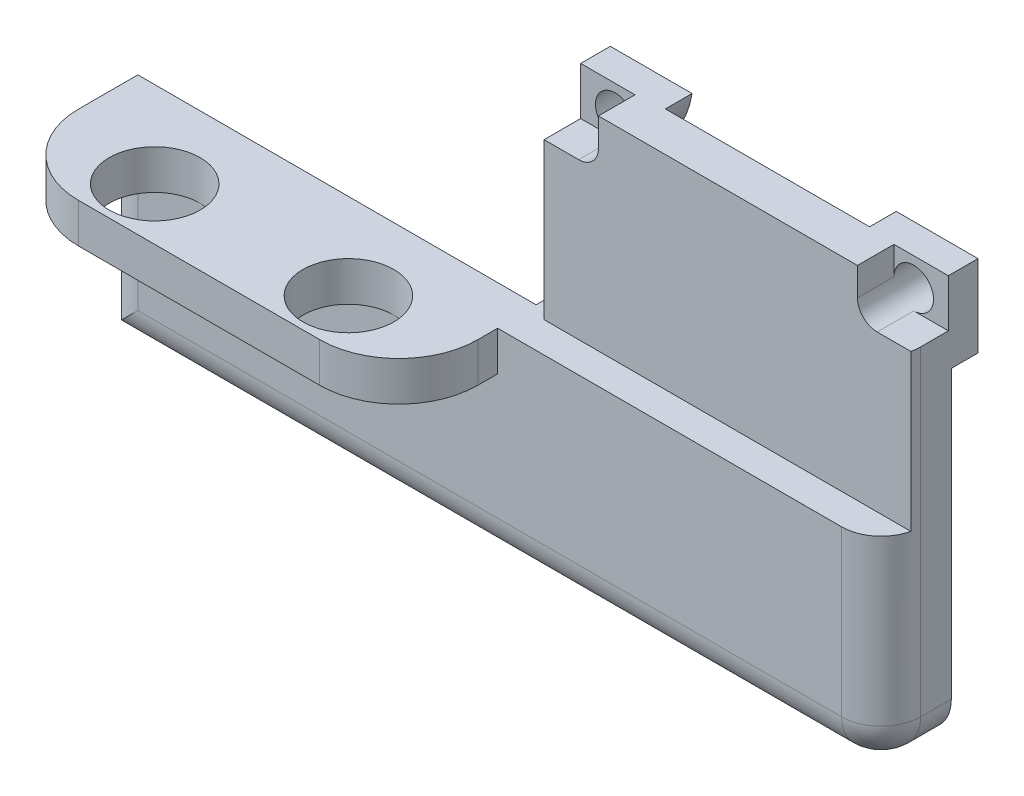
ISO-10303-21;
HEADER;
FILE_DESCRIPTION(('STEP AP214'),'2;1');
FILE_NAME('part.step','',(''),(''),'','','');
FILE_SCHEMA(('AUTOMOTIVE_DESIGN { 1 0 10303 214 1 1 1 1 }'));
ENDSEC;
DATA;
#1=APPLICATION_CONTEXT('core data for automotive mechanical design processes');
#2=APPLICATION_PROTOCOL_DEFINITION('international standard','automotive_design',2000,#1);
#3=PRODUCT_CONTEXT('',#1,'mechanical');
#4=PRODUCT('Part','Part','',(#3));
#5=PRODUCT_RELATED_PRODUCT_CATEGORY('part','',(#4));
#6=PRODUCT_DEFINITION_FORMATION('','',#4);
#7=PRODUCT_DEFINITION_CONTEXT('part definition',#1,'design');
#8=PRODUCT_DEFINITION('design','',#6,#7);
#9=PRODUCT_DEFINITION_SHAPE('','',#8);
#10=(LENGTH_UNIT() NAMED_UNIT(*) SI_UNIT(.MILLI.,.METRE.));
#11=(NAMED_UNIT(*) PLANE_ANGLE_UNIT() SI_UNIT($,.RADIAN.));
#12=(NAMED_UNIT(*) SI_UNIT($,.STERADIAN.) SOLID_ANGLE_UNIT());
#13=UNCERTAINTY_MEASURE_WITH_UNIT(LENGTH_MEASURE(1.E-05),#10,'distance_accuracy_value','');
#14=(GEOMETRIC_REPRESENTATION_CONTEXT(3) GLOBAL_UNCERTAINTY_ASSIGNED_CONTEXT((#13)) GLOBAL_UNIT_ASSIGNED_CONTEXT((#10,
#11,#12)) REPRESENTATION_CONTEXT('',''));
#15=CARTESIAN_POINT('',(0.,0.,0.));
#16=DIRECTION('',(0.,0.,1.));
#17=DIRECTION('',(1.,0.,0.));
#18=AXIS2_PLACEMENT_3D('',#15,#16,#17);
#19=CARTESIAN_POINT('',(6.1,10.325,3.));
#20=DIRECTION('',(0.,1.,0.));
#21=DIRECTION('',(0.,0.,1.));
#22=AXIS2_PLACEMENT_3D('',#19,#20,#21);
#23=CYLINDRICAL_SURFACE('',#22,4.);
#24=DIRECTION('',(0.,-1.,0.));
#25=VECTOR('',#24,1.);
#26=CARTESIAN_POINT('',(10.1,10.325,3.));
#27=LINE('',#26,#25);
#28=CARTESIAN_POINT('',(10.1,20.65,3.));
#29=VERTEX_POINT('',#28);
#30=CARTESIAN_POINT('',(10.1,18.65,3.));
#31=VERTEX_POINT('',#30);
#32=EDGE_CURVE('E509',#29,#31,#27,.T.);
#33=ORIENTED_EDGE('',*,*,#32,.F.);
#34=CARTESIAN_POINT('',(6.1,20.65,3.));
#35=DIRECTION('',(0.,-1.,0.));
#36=DIRECTION('',(0.,0.,-1.));
#37=AXIS2_PLACEMENT_3D('',#34,#35,#36);
#38=CIRCLE('',#37,4.);
#39=CARTESIAN_POINT('',(6.1,20.65,7.));
#40=VERTEX_POINT('',#39);
#41=EDGE_CURVE('E48',#40,#29,#38,.F.);
#42=ORIENTED_EDGE('',*,*,#41,.F.);
#43=DIRECTION('',(0.,-1.,0.));
#44=VECTOR('',#43,1.);
#45=CARTESIAN_POINT('',(6.1,10.325,7.));
#46=LINE('',#45,#44);
#47=CARTESIAN_POINT('',(6.1,18.65,7.));
#48=VERTEX_POINT('',#47);
#49=EDGE_CURVE('E513',#48,#40,#46,.F.);
#50=ORIENTED_EDGE('',*,*,#49,.F.);
#51=CARTESIAN_POINT('',(6.1,18.65,3.));
#52=DIRECTION('',(0.,1.,0.));
#53=DIRECTION('',(0.,0.,1.));
#54=AXIS2_PLACEMENT_3D('',#51,#52,#53);
#55=CIRCLE('',#54,4.);
#56=EDGE_CURVE('E11',#31,#48,#55,.F.);
#57=ORIENTED_EDGE('',*,*,#56,.F.);
#58=EDGE_LOOP('',(#33,#42,#50,#57));
#59=FACE_BOUND('',#58,.T.);
#60=ADVANCED_FACE('F40',(#59),#23,.T.);
#61=CARTESIAN_POINT('',(-6.1,20.65,3.));
#62=DIRECTION('',(0.,-1.,0.));
#63=DIRECTION('',(0.,0.,-1.));
#64=AXIS2_PLACEMENT_3D('',#61,#62,#63);
#65=CYLINDRICAL_SURFACE('',#64,4.);
#66=DIRECTION('',(0.,1.,0.));
#67=VECTOR('',#66,1.);
#68=CARTESIAN_POINT('',(-10.1,20.65,3.));
#69=LINE('',#68,#67);
#70=CARTESIAN_POINT('',(-10.1,18.65,3.));
#71=VERTEX_POINT('',#70);
#72=CARTESIAN_POINT('',(-10.1,20.65,3.));
#73=VERTEX_POINT('',#72);
#74=EDGE_CURVE('E479',#71,#73,#69,.T.);
#75=ORIENTED_EDGE('',*,*,#74,.F.);
#76=CARTESIAN_POINT('',(-6.1,18.65,3.));
#77=DIRECTION('',(0.,1.,0.));
#78=DIRECTION('',(0.,0.,1.));
#79=AXIS2_PLACEMENT_3D('',#76,#77,#78);
#80=CIRCLE('',#79,4.);
#81=CARTESIAN_POINT('',(-6.1,18.65,7.));
#82=VERTEX_POINT('',#81);
#83=EDGE_CURVE('E502',#82,#71,#80,.F.);
#84=ORIENTED_EDGE('',*,*,#83,.F.);
#85=DIRECTION('',(0.,1.,0.));
#86=VECTOR('',#85,1.);
#87=CARTESIAN_POINT('',(-6.1,20.65,7.));
#88=LINE('',#87,#86);
#89=CARTESIAN_POINT('',(-6.1,20.65,7.));
#90=VERTEX_POINT('',#89);
#91=EDGE_CURVE('E498',#90,#82,#88,.F.);
#92=ORIENTED_EDGE('',*,*,#91,.F.);
#93=CARTESIAN_POINT('',(-6.1,20.65,3.));
#94=DIRECTION('',(0.,-1.,0.));
#95=DIRECTION('',(0.,0.,-1.));
#96=AXIS2_PLACEMENT_3D('',#93,#94,#95);
#97=CIRCLE('',#96,4.);
#98=EDGE_CURVE('E505',#73,#90,#97,.F.);
#99=ORIENTED_EDGE('',*,*,#98,.F.);
#100=EDGE_LOOP('',(#75,#84,#92,#99));
#101=FACE_BOUND('',#100,.T.);
#102=ADVANCED_FACE('F646',(#101),#65,.T.);
#103=CARTESIAN_POINT('',(10.1,31.75,-1.4));
#104=DIRECTION('',(0.,0.,1.));
#105=DIRECTION('',(1.,0.,0.));
#106=AXIS2_PLACEMENT_3D('',#103,#104,#105);
#107=PLANE('',#106);
#108=CARTESIAN_POINT('',(12.65,29.535,-1.4));
#109=DIRECTION('',(0.,0.,1.));
#110=DIRECTION('',(1.,0.,0.));
#111=AXIS2_PLACEMENT_3D('',#108,#109,#110);
#112=CIRCLE('',#111,1.);
#113=CARTESIAN_POINT('',(13.65,29.535,-1.4));
#114=VERTEX_POINT('',#113);
#115=CARTESIAN_POINT('',(12.65,28.535,-1.4));
#116=VERTEX_POINT('',#115);
#117=EDGE_CURVE('E292',#114,#116,#112,.T.);
#118=ORIENTED_EDGE('',*,*,#117,.F.);
#119=DIRECTION('',(0.,-1.,0.));
#120=VECTOR('',#119,1.);
#121=CARTESIAN_POINT('',(13.65,29.535,-1.4));
#122=LINE('',#121,#120);
#123=CARTESIAN_POINT('',(13.65,30.95,-1.4));
#124=VERTEX_POINT('',#123);
#125=EDGE_CURVE('E254',#124,#114,#122,.T.);
#126=ORIENTED_EDGE('',*,*,#125,.F.);
#127=DIRECTION('',(-1.,0.,0.));
#128=VECTOR('',#127,1.);
#129=CARTESIAN_POINT('',(15.0355850717012,30.95,-1.4));
#130=LINE('',#129,#128);
#131=CARTESIAN_POINT('',(10.9,30.95,-1.4));
#132=VERTEX_POINT('',#131);
#133=EDGE_CURVE('E300',#124,#132,#130,.T.);
#134=ORIENTED_EDGE('',*,*,#133,.T.);
#135=DIRECTION('',(0.,-1.,0.));
#136=VECTOR('',#135,1.);
#137=CARTESIAN_POINT('',(10.9,30.95,-1.4));
#138=LINE('',#137,#136);
#139=CARTESIAN_POINT('',(10.9,28.535,-1.4));
#140=VERTEX_POINT('',#139);
#141=EDGE_CURVE('E303',#132,#140,#138,.T.);
#142=ORIENTED_EDGE('',*,*,#141,.T.);
#143=DIRECTION('',(-1.,0.,0.));
#144=VECTOR('',#143,1.);
#145=CARTESIAN_POINT('',(12.65,28.535,-1.4));
#146=LINE('',#145,#144);
#147=EDGE_CURVE('E260',#116,#140,#146,.T.);
#148=ORIENTED_EDGE('',*,*,#147,.F.);
#149=EDGE_LOOP('',(#118,#126,#134,#142,#148));
#150=FACE_BOUND('',#149,.T.);
#151=ADVANCED_FACE('F627',(#150),#107,.T.);
#152=CARTESIAN_POINT('',(10.1,20.65,2.));
#153=DIRECTION('',(0.,-1.,0.));
#154=DIRECTION('',(0.,0.,-1.));
#155=AXIS2_PLACEMENT_3D('',#152,#153,#154);
#156=PLANE('',#155);
#157=CARTESIAN_POINT('',(4.9,20.65,4.35));
#158=DIRECTION('',(0.,-1.,0.));
#159=DIRECTION('',(0.,0.,-1.));
#160=AXIS2_PLACEMENT_3D('',#157,#158,#159);
#161=CIRCLE('',#160,2.3);
#162=CARTESIAN_POINT('',(4.9,20.65,2.05));
#163=VERTEX_POINT('',#162);
#164=EDGE_CURVE('E396',#163,#163,#161,.T.);
#165=ORIENTED_EDGE('',*,*,#164,.T.);
#166=EDGE_LOOP('',(#165));
#167=FACE_BOUND('',#166,.T.);
#168=CARTESIAN_POINT('',(-4.9,20.65,4.35));
#169=DIRECTION('',(0.,-1.,0.));
#170=DIRECTION('',(0.,0.,-1.));
#171=AXIS2_PLACEMENT_3D('',#168,#169,#170);
#172=CIRCLE('',#171,2.3);
#173=CARTESIAN_POINT('',(-4.9,20.65,2.05));
#174=VERTEX_POINT('',#173);
#175=EDGE_CURVE('E387',#174,#174,#172,.T.);
#176=ORIENTED_EDGE('',*,*,#175,.T.);
#177=EDGE_LOOP('',(#176));
#178=FACE_BOUND('',#177,.T.);
#179=DIRECTION('',(-1.,0.,0.));
#180=VECTOR('',#179,1.);
#181=CARTESIAN_POINT('',(10.1,20.65,7.));
#182=LINE('',#181,#180);
#183=EDGE_CURVE('E403',#40,#90,#182,.T.);
#184=ORIENTED_EDGE('',*,*,#183,.F.);
#185=ORIENTED_EDGE('',*,*,#41,.T.);
#186=DIRECTION('',(0.,0.,-1.));
#187=VECTOR('',#186,1.);
#188=CARTESIAN_POINT('',(10.1,20.65,2.));
#189=LINE('',#188,#187);
#190=CARTESIAN_POINT('',(10.1,20.65,2.));
#191=VERTEX_POINT('',#190);
#192=EDGE_CURVE('E435',#29,#191,#189,.T.);
#193=ORIENTED_EDGE('',*,*,#192,.T.);
#194=DIRECTION('',(-1.,0.,0.));
#195=VECTOR('',#194,1.);
#196=CARTESIAN_POINT('',(0.,20.65,2.));
#197=LINE('',#196,#195);
#198=CARTESIAN_POINT('',(27.5,20.65,2.));
#199=VERTEX_POINT('',#198);
#200=EDGE_CURVE('E358',#199,#191,#197,.T.);
#201=ORIENTED_EDGE('',*,*,#200,.F.);
#202=CARTESIAN_POINT('',(27.5,20.65,0.));
#203=DIRECTION('',(0.,-1.,0.));
#204=DIRECTION('',(0.,0.,-1.));
#205=AXIS2_PLACEMENT_3D('',#202,#203,#204);
#206=CIRCLE('',#205,2.);
#207=CARTESIAN_POINT('',(29.4487175269905,20.65,0.449999999999999));
#208=VERTEX_POINT('',#207);
#209=EDGE_CURVE('E467',#199,#208,#206,.F.);
#210=ORIENTED_EDGE('',*,*,#209,.T.);
#211=DIRECTION('',(1.,0.,0.));
#212=VECTOR('',#211,1.);
#213=CARTESIAN_POINT('',(0.,20.65,0.449999999999999));
#214=LINE('',#213,#212);
#215=CARTESIAN_POINT('',(10.9,20.65,0.449999999999999));
#216=VERTEX_POINT('',#215);
#217=EDGE_CURVE('E332',#216,#208,#214,.T.);
#218=ORIENTED_EDGE('',*,*,#217,.F.);
#219=DIRECTION('',(0.,0.,-1.));
#220=VECTOR('',#219,1.);
#221=CARTESIAN_POINT('',(10.9,20.65,0.449999999999999));
#222=LINE('',#221,#220);
#223=CARTESIAN_POINT('',(10.9,20.65,-1.55));
#224=VERTEX_POINT('',#223);
#225=EDGE_CURVE('E340',#216,#224,#222,.T.);
#226=ORIENTED_EDGE('',*,*,#225,.T.);
#227=DIRECTION('',(-1.,0.,0.));
#228=VECTOR('',#227,1.);
#229=CARTESIAN_POINT('',(0.,20.65,-1.55));
#230=LINE('',#229,#228);
#231=CARTESIAN_POINT('',(10.0451217911903,20.65,-1.55));
#232=VERTEX_POINT('',#231);
#233=EDGE_CURVE('E363',#224,#232,#230,.T.);
#234=ORIENTED_EDGE('',*,*,#233,.T.);
#235=DIRECTION('',(0.,0.,-1.));
#236=VECTOR('',#235,1.);
#237=CARTESIAN_POINT('',(10.0451217911903,20.65,2.));
#238=LINE('',#237,#236);
#239=CARTESIAN_POINT('',(10.0451217911903,20.65,0.));
#240=VERTEX_POINT('',#239);
#241=EDGE_CURVE('E362',#240,#232,#238,.T.);
#242=ORIENTED_EDGE('',*,*,#241,.F.);
#243=DIRECTION('',(-1.,0.,0.));
#244=VECTOR('',#243,1.);
#245=CARTESIAN_POINT('',(10.1,20.65,0.));
#246=LINE('',#245,#244);
#247=CARTESIAN_POINT('',(-10.1,20.65,0.));
#248=VERTEX_POINT('',#247);
#249=EDGE_CURVE('E428',#240,#248,#246,.T.);
#250=ORIENTED_EDGE('',*,*,#249,.T.);
#251=DIRECTION('',(0.,0.,-1.));
#252=VECTOR('',#251,1.);
#253=CARTESIAN_POINT('',(-10.1,20.65,2.));
#254=LINE('',#253,#252);
#255=EDGE_CURVE('E432',#73,#248,#254,.T.);
#256=ORIENTED_EDGE('',*,*,#255,.F.);
#257=ORIENTED_EDGE('',*,*,#98,.T.);
#258=EDGE_LOOP('',(#184,#185,#193,#201,#210,#218,#226,#234,#242,#250,#256,#257));
#259=FACE_BOUND('',#258,.T.);
#260=ADVANCED_FACE('F518',(#167,#178,#259),#156,.F.);
#261=CARTESIAN_POINT('',(-10.1,20.65,2.));
#262=DIRECTION('',(1.,0.,0.));
#263=DIRECTION('',(0.,0.,-1.));
#264=AXIS2_PLACEMENT_3D('',#261,#262,#263);
#265=PLANE('',#264);
#266=DIRECTION('',(0.,0.,-1.));
#267=VECTOR('',#266,1.);
#268=CARTESIAN_POINT('',(-10.1,18.65,7.));
#269=LINE('',#268,#267);
#270=CARTESIAN_POINT('',(-10.1,18.65,0.));
#271=VERTEX_POINT('',#270);
#272=EDGE_CURVE('E416',#71,#271,#269,.T.);
#273=ORIENTED_EDGE('',*,*,#272,.F.);
#274=ORIENTED_EDGE('',*,*,#74,.T.);
#275=ORIENTED_EDGE('',*,*,#255,.T.);
#276=DIRECTION('',(0.,-1.,0.));
#277=VECTOR('',#276,1.);
#278=CARTESIAN_POINT('',(-10.1,20.65,0.));
#279=LINE('',#278,#277);
#280=EDGE_CURVE('E420',#248,#271,#279,.T.);
#281=ORIENTED_EDGE('',*,*,#280,.T.);
#282=EDGE_LOOP('',(#273,#274,#275,#281));
#283=FACE_BOUND('',#282,.T.);
#284=ADVANCED_FACE('F675',(#283),#265,.F.);
#285=CARTESIAN_POINT('',(-10.1,10.325,2.));
#286=DIRECTION('',(0.,1.,0.));
#287=DIRECTION('',(0.,0.,1.));
#288=AXIS2_PLACEMENT_3D('',#285,#286,#287);
#289=PLANE('',#288);
#290=DIRECTION('',(-1.,0.,0.));
#291=VECTOR('',#290,1.);
#292=CARTESIAN_POINT('',(0.,10.325,-1.55));
#293=LINE('',#292,#291);
#294=CARTESIAN_POINT('',(27.5,10.325,-1.55));
#295=VERTEX_POINT('',#294);
#296=CARTESIAN_POINT('',(10.0451217911903,10.325,-1.55));
#297=VERTEX_POINT('',#296);
#298=EDGE_CURVE('E367',#295,#297,#293,.T.);
#299=ORIENTED_EDGE('',*,*,#298,.F.);
#300=DIRECTION('',(0.,0.,-1.));
#301=VECTOR('',#300,1.);
#302=CARTESIAN_POINT('',(27.5,10.325,2.));
#303=LINE('',#302,#301);
#304=CARTESIAN_POINT('',(27.5,10.325,0.));
#305=VERTEX_POINT('',#304);
#306=EDGE_CURVE('E455',#295,#305,#303,.F.);
#307=ORIENTED_EDGE('',*,*,#306,.T.);
#308=DIRECTION('',(1.,0.,0.));
#309=VECTOR('',#308,1.);
#310=CARTESIAN_POINT('',(-10.1,10.325,0.));
#311=LINE('',#310,#309);
#312=CARTESIAN_POINT('',(10.0451217911903,10.325,0.));
#313=VERTEX_POINT('',#312);
#314=EDGE_CURVE('E452',#305,#313,#311,.F.);
#315=ORIENTED_EDGE('',*,*,#314,.T.);
#316=DIRECTION('',(0.,0.,-1.));
#317=VECTOR('',#316,1.);
#318=CARTESIAN_POINT('',(10.0451217911903,10.325,2.));
#319=LINE('',#318,#317);
#320=EDGE_CURVE('E378',#313,#297,#319,.T.);
#321=ORIENTED_EDGE('',*,*,#320,.T.);
#322=EDGE_LOOP('',(#299,#307,#315,#321));
#323=FACE_BOUND('',#322,.T.);
#324=ADVANCED_FACE('F678',(#323),#289,.F.);
#325=CARTESIAN_POINT('',(10.1,10.325,2.));
#326=DIRECTION('',(-1.,0.,0.));
#327=DIRECTION('',(0.,0.,1.));
#328=AXIS2_PLACEMENT_3D('',#325,#326,#327);
#329=PLANE('',#328);
#330=ORIENTED_EDGE('',*,*,#192,.F.);
#331=ORIENTED_EDGE('',*,*,#32,.T.);
#332=DIRECTION('',(0.,0.,-1.));
#333=VECTOR('',#332,1.);
#334=CARTESIAN_POINT('',(10.1,18.65,7.));
#335=LINE('',#334,#333);
#336=CARTESIAN_POINT('',(10.1,18.65,2.));
#337=VERTEX_POINT('',#336);
#338=EDGE_CURVE('E410',#31,#337,#335,.T.);
#339=ORIENTED_EDGE('',*,*,#338,.T.);
#340=DIRECTION('',(0.,1.,0.));
#341=VECTOR('',#340,1.);
#342=CARTESIAN_POINT('',(10.1,10.325,2.));
#343=LINE('',#342,#341);
#344=EDGE_CURVE('E382',#337,#191,#343,.T.);
#345=ORIENTED_EDGE('',*,*,#344,.T.);
#346=EDGE_LOOP('',(#330,#331,#339,#345));
#347=FACE_BOUND('',#346,.T.);
#348=ADVANCED_FACE('F522',(#347),#329,.F.);
#349=CARTESIAN_POINT('',(0.,0.,2.));
#350=DIRECTION('',(0.,0.,1.));
#351=DIRECTION('',(1.,0.,0.));
#352=AXIS2_PLACEMENT_3D('',#349,#350,#351);
#353=PLANE('',#352);
#354=DIRECTION('',(1.,0.,0.));
#355=VECTOR('',#354,1.);
#356=CARTESIAN_POINT('',(-10.1,18.65,2.));
#357=LINE('',#356,#355);
#358=CARTESIAN_POINT('',(-8.1,18.65,2.));
#359=VERTEX_POINT('',#358);
#360=EDGE_CURVE('E391',#359,#337,#357,.T.);
#361=ORIENTED_EDGE('',*,*,#360,.F.);
#362=DIRECTION('',(0.,-1.,0.));
#363=VECTOR('',#362,1.);
#364=CARTESIAN_POINT('',(-8.1,10.325,2.));
#365=LINE('',#364,#363);
#366=CARTESIAN_POINT('',(-8.1,12.325,2.));
#367=VERTEX_POINT('',#366);
#368=EDGE_CURVE('E464',#359,#367,#365,.T.);
#369=ORIENTED_EDGE('',*,*,#368,.T.);
#370=DIRECTION('',(1.,0.,0.));
#371=VECTOR('',#370,1.);
#372=CARTESIAN_POINT('',(29.5,12.325,2.));
#373=LINE('',#372,#371);
#374=CARTESIAN_POINT('',(27.5,12.325,2.));
#375=VERTEX_POINT('',#374);
#376=EDGE_CURVE('E458',#367,#375,#373,.T.);
#377=ORIENTED_EDGE('',*,*,#376,.T.);
#378=DIRECTION('',(0.,1.,0.));
#379=VECTOR('',#378,1.);
#380=CARTESIAN_POINT('',(27.5,20.65,2.));
#381=LINE('',#380,#379);
#382=EDGE_CURVE('E461',#375,#199,#381,.T.);
#383=ORIENTED_EDGE('',*,*,#382,.T.);
#384=ORIENTED_EDGE('',*,*,#200,.T.);
#385=ORIENTED_EDGE('',*,*,#344,.F.);
#386=EDGE_LOOP('',(#361,#369,#377,#383,#384,#385));
#387=FACE_BOUND('',#386,.T.);
#388=ADVANCED_FACE('F526',(#387),#353,.T.);
#389=CARTESIAN_POINT('',(0.,0.,0.));
#390=DIRECTION('',(0.,0.,1.));
#391=DIRECTION('',(1.,0.,0.));
#392=AXIS2_PLACEMENT_3D('',#389,#390,#391);
#393=PLANE('',#392);
#394=ORIENTED_EDGE('',*,*,#249,.F.);
#395=DIRECTION('',(0.,-1.,0.));
#396=VECTOR('',#395,1.);
#397=CARTESIAN_POINT('',(10.0451217911903,0.,0.));
#398=LINE('',#397,#396);
#399=EDGE_CURVE('E438',#240,#313,#398,.T.);
#400=ORIENTED_EDGE('',*,*,#399,.T.);
#401=DIRECTION('',(1.,0.,0.));
#402=VECTOR('',#401,1.);
#403=CARTESIAN_POINT('',(-10.1,10.325,0.));
#404=LINE('',#403,#402);
#405=CARTESIAN_POINT('',(-10.1,10.325,0.));
#406=VERTEX_POINT('',#405);
#407=EDGE_CURVE('E424',#406,#313,#404,.T.);
#408=ORIENTED_EDGE('',*,*,#407,.F.);
#409=EDGE_CURVE('E419',#271,#406,#279,.T.);
#410=ORIENTED_EDGE('',*,*,#409,.F.);
#411=ORIENTED_EDGE('',*,*,#280,.F.);
#412=EDGE_LOOP('',(#394,#400,#408,#410,#411));
#413=FACE_BOUND('',#412,.T.);
#414=ADVANCED_FACE('F688',(#413),#393,.F.);
#415=CARTESIAN_POINT('',(-10.1,18.65,7.));
#416=DIRECTION('',(0.,1.,0.));
#417=DIRECTION('',(0.,0.,1.));
#418=AXIS2_PLACEMENT_3D('',#415,#416,#417);
#419=PLANE('',#418);
#420=CARTESIAN_POINT('',(-4.9,18.65,4.35));
#421=DIRECTION('',(0.,-1.,0.));
#422=DIRECTION('',(0.,0.,-1.));
#423=AXIS2_PLACEMENT_3D('',#420,#421,#422);
#424=CIRCLE('',#423,2.3);
#425=CARTESIAN_POINT('',(-4.9,18.65,2.05));
#426=VERTEX_POINT('',#425);
#427=EDGE_CURVE('E392',#426,#426,#424,.T.);
#428=ORIENTED_EDGE('',*,*,#427,.F.);
#429=EDGE_LOOP('',(#428));
#430=FACE_BOUND('',#429,.T.);
#431=CARTESIAN_POINT('',(4.9,18.65,4.35));
#432=DIRECTION('',(0.,-1.,0.));
#433=DIRECTION('',(0.,0.,-1.));
#434=AXIS2_PLACEMENT_3D('',#431,#432,#433);
#435=CIRCLE('',#434,2.3);
#436=CARTESIAN_POINT('',(4.9,18.65,2.05));
#437=VERTEX_POINT('',#436);
#438=EDGE_CURVE('E386',#437,#437,#435,.T.);
#439=ORIENTED_EDGE('',*,*,#438,.F.);
#440=EDGE_LOOP('',(#439));
#441=FACE_BOUND('',#440,.T.);
#442=ORIENTED_EDGE('',*,*,#338,.F.);
#443=ORIENTED_EDGE('',*,*,#56,.T.);
#444=DIRECTION('',(1.,0.,0.));
#445=VECTOR('',#444,1.);
#446=CARTESIAN_POINT('',(-10.1,18.65,7.));
#447=LINE('',#446,#445);
#448=EDGE_CURVE('E406',#82,#48,#447,.T.);
#449=ORIENTED_EDGE('',*,*,#448,.F.);
#450=ORIENTED_EDGE('',*,*,#83,.T.);
#451=ORIENTED_EDGE('',*,*,#272,.T.);
#452=CARTESIAN_POINT('',(-8.1,18.65,0.));
#453=DIRECTION('',(0.,1.,0.));
#454=DIRECTION('',(0.,0.,1.));
#455=AXIS2_PLACEMENT_3D('',#452,#453,#454);
#456=CIRCLE('',#455,2.);
#457=EDGE_CURVE('E476',#271,#359,#456,.T.);
#458=ORIENTED_EDGE('',*,*,#457,.T.);
#459=ORIENTED_EDGE('',*,*,#360,.T.);
#460=EDGE_LOOP('',(#442,#443,#449,#450,#451,#458,#459));
#461=FACE_BOUND('',#460,.T.);
#462=ADVANCED_FACE('F691',(#430,#441,#461),#419,.F.);
#463=CARTESIAN_POINT('',(0.,0.,7.));
#464=DIRECTION('',(0.,0.,1.));
#465=DIRECTION('',(1.,0.,0.));
#466=AXIS2_PLACEMENT_3D('',#463,#464,#465);
#467=PLANE('',#466);
#468=ORIENTED_EDGE('',*,*,#448,.T.);
#469=ORIENTED_EDGE('',*,*,#49,.T.);
#470=ORIENTED_EDGE('',*,*,#183,.T.);
#471=ORIENTED_EDGE('',*,*,#91,.T.);
#472=EDGE_LOOP('',(#468,#469,#470,#471));
#473=FACE_BOUND('',#472,.T.);
#474=ADVANCED_FACE('F697',(#473),#467,.T.);
#475=CARTESIAN_POINT('',(4.9,20.65,4.35));
#476=DIRECTION('',(0.,-1.,0.));
#477=DIRECTION('',(0.,0.,-1.));
#478=AXIS2_PLACEMENT_3D('',#475,#476,#477);
#479=CYLINDRICAL_SURFACE('',#478,2.3);
#480=ORIENTED_EDGE('',*,*,#164,.F.);
#481=EDGE_LOOP('',(#480));
#482=FACE_BOUND('',#481,.T.);
#483=ORIENTED_EDGE('',*,*,#438,.T.);
#484=EDGE_LOOP('',(#483));
#485=FACE_BOUND('',#484,.T.);
#486=ADVANCED_FACE('F701',(#482,#485),#479,.F.);
#487=CARTESIAN_POINT('',(-4.9,20.65,4.35));
#488=DIRECTION('',(0.,-1.,0.));
#489=DIRECTION('',(0.,0.,-1.));
#490=AXIS2_PLACEMENT_3D('',#487,#488,#489);
#491=CYLINDRICAL_SURFACE('',#490,2.3);
#492=ORIENTED_EDGE('',*,*,#175,.F.);
#493=EDGE_LOOP('',(#492));
#494=FACE_BOUND('',#493,.T.);
#495=ORIENTED_EDGE('',*,*,#427,.T.);
#496=EDGE_LOOP('',(#495));
#497=FACE_BOUND('',#496,.T.);
#498=ADVANCED_FACE('F705',(#494,#497),#491,.F.);
#499=CARTESIAN_POINT('',(10.0451217911903,0.,2.));
#500=DIRECTION('',(-1.,0.,0.));
#501=DIRECTION('',(0.,0.,1.));
#502=AXIS2_PLACEMENT_3D('',#499,#500,#501);
#503=PLANE('',#502);
#504=ORIENTED_EDGE('',*,*,#399,.F.);
#505=ORIENTED_EDGE('',*,*,#241,.T.);
#506=DIRECTION('',(0.,1.,0.));
#507=VECTOR('',#506,1.);
#508=CARTESIAN_POINT('',(10.0451217911903,0.,-1.55));
#509=LINE('',#508,#507);
#510=EDGE_CURVE('E357',#297,#232,#509,.T.);
#511=ORIENTED_EDGE('',*,*,#510,.F.);
#512=ORIENTED_EDGE('',*,*,#320,.F.);
#513=EDGE_LOOP('',(#504,#505,#511,#512));
#514=FACE_BOUND('',#513,.T.);
#515=ADVANCED_FACE('F709',(#514),#503,.T.);
#516=CARTESIAN_POINT('',(29.5,0.,2.));
#517=DIRECTION('',(-1.,0.,0.));
#518=DIRECTION('',(0.,-1.,0.));
#519=AXIS2_PLACEMENT_3D('',#516,#517,#518);
#520=PLANE('',#519);
#521=DIRECTION('',(0.,1.,0.));
#522=VECTOR('',#521,1.);
#523=CARTESIAN_POINT('',(29.5,10.325,0.));
#524=LINE('',#523,#522);
#525=CARTESIAN_POINT('',(29.5,28.535,0.));
#526=VERTEX_POINT('',#525);
#527=CARTESIAN_POINT('',(29.5,12.325,0.));
#528=VERTEX_POINT('',#527);
#529=EDGE_CURVE('E442',#526,#528,#524,.F.);
#530=ORIENTED_EDGE('',*,*,#529,.T.);
#531=DIRECTION('',(0.,0.,-1.));
#532=VECTOR('',#531,1.);
#533=CARTESIAN_POINT('',(29.5,12.325,2.));
#534=LINE('',#533,#532);
#535=CARTESIAN_POINT('',(29.5,12.325,-1.55));
#536=VERTEX_POINT('',#535);
#537=EDGE_CURVE('E445',#528,#536,#534,.T.);
#538=ORIENTED_EDGE('',*,*,#537,.T.);
#539=DIRECTION('',(0.,1.,0.));
#540=VECTOR('',#539,1.);
#541=CARTESIAN_POINT('',(29.5,0.,-1.55));
#542=LINE('',#541,#540);
#543=CARTESIAN_POINT('',(29.5,26.8144149282988,-1.55));
#544=VERTEX_POINT('',#543);
#545=EDGE_CURVE('E370',#536,#544,#542,.T.);
#546=ORIENTED_EDGE('',*,*,#545,.T.);
#547=DIRECTION('',(0.,0.,-1.));
#548=VECTOR('',#547,1.);
#549=CARTESIAN_POINT('',(29.5,26.8144149282988,-0.900000000000001));
#550=LINE('',#549,#548);
#551=CARTESIAN_POINT('',(29.5,26.8144149282988,-2.9));
#552=VERTEX_POINT('',#551);
#553=EDGE_CURVE('E572',#544,#552,#550,.T.);
#554=ORIENTED_EDGE('',*,*,#553,.T.);
#555=DIRECTION('',(0.,1.,0.));
#556=VECTOR('',#555,1.);
#557=CARTESIAN_POINT('',(29.5,0.,-2.9));
#558=LINE('',#557,#556);
#559=CARTESIAN_POINT('',(29.5,30.95,-2.9));
#560=VERTEX_POINT('',#559);
#561=EDGE_CURVE('E567',#552,#560,#558,.T.);
#562=ORIENTED_EDGE('',*,*,#561,.T.);
#563=DIRECTION('',(0.,0.,-1.));
#564=VECTOR('',#563,1.);
#565=CARTESIAN_POINT('',(29.5,30.95,-1.4));
#566=LINE('',#565,#564);
#567=CARTESIAN_POINT('',(29.5,30.95,-1.4));
#568=VERTEX_POINT('',#567);
#569=EDGE_CURVE('E542',#568,#560,#566,.T.);
#570=ORIENTED_EDGE('',*,*,#569,.F.);
#571=DIRECTION('',(0.,1.,0.));
#572=VECTOR('',#571,1.);
#573=CARTESIAN_POINT('',(29.5,0.,-1.4));
#574=LINE('',#573,#572);
#575=CARTESIAN_POINT('',(29.5,28.535,-1.4));
#576=VERTEX_POINT('',#575);
#577=EDGE_CURVE('E248',#576,#568,#574,.T.);
#578=ORIENTED_EDGE('',*,*,#577,.F.);
#579=DIRECTION('',(0.,0.,-1.));
#580=VECTOR('',#579,1.);
#581=CARTESIAN_POINT('',(29.5,28.535,-0.900000000000001));
#582=LINE('',#581,#580);
#583=EDGE_CURVE('E246',#526,#576,#582,.T.);
#584=ORIENTED_EDGE('',*,*,#583,.F.);
#585=EDGE_LOOP('',(#530,#538,#546,#554,#562,#570,#578,#584));
#586=FACE_BOUND('',#585,.T.);
#587=ADVANCED_FACE('F594',(#586),#520,.F.);
#588=CARTESIAN_POINT('',(0.,0.,-1.55));
#589=DIRECTION('',(0.,0.,1.));
#590=DIRECTION('',(1.,0.,0.));
#591=AXIS2_PLACEMENT_3D('',#588,#589,#590);
#592=PLANE('',#591);
#593=ORIENTED_EDGE('',*,*,#545,.F.);
#594=CARTESIAN_POINT('',(27.5,12.325,-1.55));
#595=DIRECTION('',(0.,0.,1.));
#596=DIRECTION('',(1.,0.,0.));
#597=AXIS2_PLACEMENT_3D('',#594,#595,#596);
#598=CIRCLE('',#597,2.);
#599=EDGE_CURVE('E449',#536,#295,#598,.F.);
#600=ORIENTED_EDGE('',*,*,#599,.T.);
#601=ORIENTED_EDGE('',*,*,#298,.T.);
#602=ORIENTED_EDGE('',*,*,#510,.T.);
#603=ORIENTED_EDGE('',*,*,#233,.F.);
#604=DIRECTION('',(0.,-1.,0.));
#605=VECTOR('',#604,1.);
#606=CARTESIAN_POINT('',(10.9,0.,-1.55));
#607=LINE('',#606,#605);
#608=CARTESIAN_POINT('',(10.9,26.8144149282988,-1.55));
#609=VERTEX_POINT('',#608);
#610=EDGE_CURVE('E328',#609,#224,#607,.T.);
#611=ORIENTED_EDGE('',*,*,#610,.F.);
#612=CARTESIAN_POINT('',(10.1,31.75,-1.55));
#613=DIRECTION('',(0.,0.,1.));
#614=DIRECTION('',(1.,0.,0.));
#615=AXIS2_PLACEMENT_3D('',#612,#613,#614);
#616=CIRCLE('',#615,5.);
#617=CARTESIAN_POINT('',(15.0355850717012,30.95,-1.55));
#618=VERTEX_POINT('',#617);
#619=EDGE_CURVE('E333',#618,#609,#616,.F.);
#620=ORIENTED_EDGE('',*,*,#619,.F.);
#621=DIRECTION('',(-1.,0.,0.));
#622=VECTOR('',#621,1.);
#623=CARTESIAN_POINT('',(0.,30.95,-1.55));
#624=LINE('',#623,#622);
#625=CARTESIAN_POINT('',(25.3644149282988,30.95,-1.55));
#626=VERTEX_POINT('',#625);
#627=EDGE_CURVE('E347',#626,#618,#624,.T.);
#628=ORIENTED_EDGE('',*,*,#627,.F.);
#629=CARTESIAN_POINT('',(30.3,31.75,-1.55));
#630=DIRECTION('',(0.,0.,1.));
#631=DIRECTION('',(1.,0.,0.));
#632=AXIS2_PLACEMENT_3D('',#629,#630,#631);
#633=CIRCLE('',#632,5.);
#634=EDGE_CURVE('E343',#544,#626,#633,.F.);
#635=ORIENTED_EDGE('',*,*,#634,.F.);
#636=EDGE_LOOP('',(#593,#600,#601,#602,#603,#611,#620,#628,#635));
#637=FACE_BOUND('',#636,.T.);
#638=ADVANCED_FACE('F609',(#637),#592,.F.);
#639=CARTESIAN_POINT('',(10.9,0.,0.449999999999999));
#640=DIRECTION('',(1.,0.,0.));
#641=DIRECTION('',(0.,1.,0.));
#642=AXIS2_PLACEMENT_3D('',#639,#640,#641);
#643=PLANE('',#642);
#644=ORIENTED_EDGE('',*,*,#610,.T.);
#645=ORIENTED_EDGE('',*,*,#225,.F.);
#646=DIRECTION('',(0.,-1.,0.));
#647=VECTOR('',#646,1.);
#648=CARTESIAN_POINT('',(10.9,0.,0.449999999999999));
#649=LINE('',#648,#647);
#650=CARTESIAN_POINT('',(10.9,28.535,0.449999999999999));
#651=VERTEX_POINT('',#650);
#652=EDGE_CURVE('E329',#651,#216,#649,.T.);
#653=ORIENTED_EDGE('',*,*,#652,.F.);
#654=DIRECTION('',(0.,0.,-1.));
#655=VECTOR('',#654,1.);
#656=CARTESIAN_POINT('',(10.9,28.535,0.449999999999999));
#657=LINE('',#656,#655);
#658=EDGE_CURVE('E275',#651,#140,#657,.T.);
#659=ORIENTED_EDGE('',*,*,#658,.T.);
#660=ORIENTED_EDGE('',*,*,#141,.F.);
#661=DIRECTION('',(0.,0.,-1.));
#662=VECTOR('',#661,1.);
#663=CARTESIAN_POINT('',(10.9,30.95,-1.4));
#664=LINE('',#663,#662);
#665=CARTESIAN_POINT('',(10.9,30.95,-2.9));
#666=VERTEX_POINT('',#665);
#667=EDGE_CURVE('E324',#132,#666,#664,.T.);
#668=ORIENTED_EDGE('',*,*,#667,.T.);
#669=DIRECTION('',(0.,-1.,0.));
#670=VECTOR('',#669,1.);
#671=CARTESIAN_POINT('',(10.9,30.95,-2.9));
#672=LINE('',#671,#670);
#673=CARTESIAN_POINT('',(10.9,26.8144149282988,-2.9));
#674=VERTEX_POINT('',#673);
#675=EDGE_CURVE('E312',#666,#674,#672,.T.);
#676=ORIENTED_EDGE('',*,*,#675,.T.);
#677=DIRECTION('',(0.,0.,-1.));
#678=VECTOR('',#677,1.);
#679=CARTESIAN_POINT('',(10.9,26.8144149282988,-1.4));
#680=LINE('',#679,#678);
#681=EDGE_CURVE('E321',#609,#674,#680,.T.);
#682=ORIENTED_EDGE('',*,*,#681,.F.);
#683=EDGE_LOOP('',(#644,#645,#653,#659,#660,#668,#676,#682));
#684=FACE_BOUND('',#683,.T.);
#685=ADVANCED_FACE('F621',(#684),#643,.F.);
#686=CARTESIAN_POINT('',(0.,30.95,0.449999999999999));
#687=DIRECTION('',(0.,-1.,0.));
#688=DIRECTION('',(1.,0.,0.));
#689=AXIS2_PLACEMENT_3D('',#686,#687,#688);
#690=PLANE('',#689);
#691=ORIENTED_EDGE('',*,*,#627,.T.);
#692=DIRECTION('',(0.,0.,-1.));
#693=VECTOR('',#692,1.);
#694=CARTESIAN_POINT('',(15.0355850717012,30.95,-1.4));
#695=LINE('',#694,#693);
#696=CARTESIAN_POINT('',(15.0355850717012,30.95,-2.9));
#697=VERTEX_POINT('',#696);
#698=EDGE_CURVE('E308',#618,#697,#695,.T.);
#699=ORIENTED_EDGE('',*,*,#698,.T.);
#700=DIRECTION('',(-1.,0.,0.));
#701=VECTOR('',#700,1.);
#702=CARTESIAN_POINT('',(15.0355850717012,30.95,-2.9));
#703=LINE('',#702,#701);
#704=EDGE_CURVE('E296',#697,#666,#703,.T.);
#705=ORIENTED_EDGE('',*,*,#704,.T.);
#706=ORIENTED_EDGE('',*,*,#667,.F.);
#707=ORIENTED_EDGE('',*,*,#133,.F.);
#708=DIRECTION('',(0.,0.,-1.));
#709=VECTOR('',#708,1.);
#710=CARTESIAN_POINT('',(13.65,30.95,0.449999999999999));
#711=LINE('',#710,#709);
#712=CARTESIAN_POINT('',(13.65,30.95,0.449999999999999));
#713=VERTEX_POINT('',#712);
#714=EDGE_CURVE('E288',#713,#124,#711,.T.);
#715=ORIENTED_EDGE('',*,*,#714,.F.);
#716=DIRECTION('',(-1.,0.,0.));
#717=VECTOR('',#716,1.);
#718=CARTESIAN_POINT('',(0.,30.95,0.449999999999999));
#719=LINE('',#718,#717);
#720=CARTESIAN_POINT('',(26.75,30.95,0.449999999999999));
#721=VERTEX_POINT('',#720);
#722=EDGE_CURVE('E337',#721,#713,#719,.T.);
#723=ORIENTED_EDGE('',*,*,#722,.F.);
#724=DIRECTION('',(0.,0.,-1.));
#725=VECTOR('',#724,1.);
#726=CARTESIAN_POINT('',(26.75,30.95,-0.900000000000001));
#727=LINE('',#726,#725);
#728=CARTESIAN_POINT('',(26.75,30.95,-1.4));
#729=VERTEX_POINT('',#728);
#730=EDGE_CURVE('E262',#721,#729,#727,.T.);
#731=ORIENTED_EDGE('',*,*,#730,.T.);
#732=DIRECTION('',(-1.,0.,0.));
#733=VECTOR('',#732,1.);
#734=CARTESIAN_POINT('',(0.,30.95,-1.4));
#735=LINE('',#734,#733);
#736=EDGE_CURVE('E583',#568,#729,#735,.T.);
#737=ORIENTED_EDGE('',*,*,#736,.F.);
#738=ORIENTED_EDGE('',*,*,#569,.T.);
#739=DIRECTION('',(-1.,0.,0.));
#740=VECTOR('',#739,1.);
#741=CARTESIAN_POINT('',(0.,30.95,-2.9));
#742=LINE('',#741,#740);
#743=CARTESIAN_POINT('',(25.3644149282988,30.95,-2.9));
#744=VERTEX_POINT('',#743);
#745=EDGE_CURVE('E559',#560,#744,#742,.T.);
#746=ORIENTED_EDGE('',*,*,#745,.T.);
#747=DIRECTION('',(0.,0.,-1.));
#748=VECTOR('',#747,1.);
#749=CARTESIAN_POINT('',(25.3644149282988,30.95,-0.900000000000001));
#750=LINE('',#749,#748);
#751=EDGE_CURVE('E575',#626,#744,#750,.T.);
#752=ORIENTED_EDGE('',*,*,#751,.F.);
#753=EDGE_LOOP('',(#691,#699,#705,#706,#707,#715,#723,#731,#737,#738,#746,#752));
#754=FACE_BOUND('',#753,.T.);
#755=ADVANCED_FACE('F582',(#754),#690,.F.);
#756=CARTESIAN_POINT('',(0.,0.,0.449999999999999));
#757=DIRECTION('',(0.,0.,1.));
#758=DIRECTION('',(1.,0.,0.));
#759=AXIS2_PLACEMENT_3D('',#756,#757,#758);
#760=PLANE('',#759);
#761=ORIENTED_EDGE('',*,*,#217,.T.);
#762=DIRECTION('',(0.,-1.,0.));
#763=VECTOR('',#762,1.);
#764=CARTESIAN_POINT('',(29.4487175269905,20.65,0.449999999999999));
#765=LINE('',#764,#763);
#766=CARTESIAN_POINT('',(29.4487175269905,28.535,0.449999999999999));
#767=VERTEX_POINT('',#766);
#768=EDGE_CURVE('E470',#208,#767,#765,.F.);
#769=ORIENTED_EDGE('',*,*,#768,.T.);
#770=DIRECTION('',(-1.,0.,0.));
#771=VECTOR('',#770,1.);
#772=CARTESIAN_POINT('',(29.5,28.535,0.449999999999999));
#773=LINE('',#772,#771);
#774=CARTESIAN_POINT('',(27.75,28.535,0.449999999999999));
#775=VERTEX_POINT('',#774);
#776=EDGE_CURVE('E540',#767,#775,#773,.T.);
#777=ORIENTED_EDGE('',*,*,#776,.T.);
#778=CARTESIAN_POINT('',(27.75,29.535,0.449999999999999));
#779=DIRECTION('',(0.,0.,-1.));
#780=DIRECTION('',(1.,0.,0.));
#781=AXIS2_PLACEMENT_3D('',#778,#779,#780);
#782=CIRCLE('',#781,1.);
#783=CARTESIAN_POINT('',(26.75,29.535,0.449999999999999));
#784=VERTEX_POINT('',#783);
#785=EDGE_CURVE('E252',#775,#784,#782,.T.);
#786=ORIENTED_EDGE('',*,*,#785,.T.);
#787=DIRECTION('',(0.,1.,0.));
#788=VECTOR('',#787,1.);
#789=CARTESIAN_POINT('',(26.75,29.535,0.449999999999999));
#790=LINE('',#789,#788);
#791=EDGE_CURVE('E546',#784,#721,#790,.T.);
#792=ORIENTED_EDGE('',*,*,#791,.T.);
#793=ORIENTED_EDGE('',*,*,#722,.T.);
#794=DIRECTION('',(0.,-1.,0.));
#795=VECTOR('',#794,1.);
#796=CARTESIAN_POINT('',(13.65,29.535,0.449999999999999));
#797=LINE('',#796,#795);
#798=CARTESIAN_POINT('',(13.65,29.535,0.449999999999999));
#799=VERTEX_POINT('',#798);
#800=EDGE_CURVE('E266',#713,#799,#797,.T.);
#801=ORIENTED_EDGE('',*,*,#800,.T.);
#802=CARTESIAN_POINT('',(12.65,29.535,0.449999999999999));
#803=DIRECTION('',(0.,0.,-1.));
#804=DIRECTION('',(1.,0.,0.));
#805=AXIS2_PLACEMENT_3D('',#802,#803,#804);
#806=CIRCLE('',#805,1.);
#807=CARTESIAN_POINT('',(12.65,28.535,0.449999999999999));
#808=VERTEX_POINT('',#807);
#809=EDGE_CURVE('E269',#799,#808,#806,.T.);
#810=ORIENTED_EDGE('',*,*,#809,.T.);
#811=DIRECTION('',(-1.,0.,0.));
#812=VECTOR('',#811,1.);
#813=CARTESIAN_POINT('',(12.65,28.535,0.449999999999999));
#814=LINE('',#813,#812);
#815=EDGE_CURVE('E272',#808,#651,#814,.T.);
#816=ORIENTED_EDGE('',*,*,#815,.T.);
#817=ORIENTED_EDGE('',*,*,#652,.T.);
#818=EDGE_LOOP('',(#761,#769,#777,#786,#792,#793,#801,#810,#816,#817));
#819=FACE_BOUND('',#818,.T.);
#820=ADVANCED_FACE('F539',(#819),#760,.T.);
#821=CARTESIAN_POINT('',(10.1,31.75,-1.4));
#822=DIRECTION('',(0.,0.,-1.));
#823=DIRECTION('',(-1.,0.,0.));
#824=AXIS2_PLACEMENT_3D('',#821,#822,#823);
#825=CYLINDRICAL_SURFACE('',#824,5.);
#826=ORIENTED_EDGE('',*,*,#698,.F.);
#827=ORIENTED_EDGE('',*,*,#619,.T.);
#828=ORIENTED_EDGE('',*,*,#681,.T.);
#829=CARTESIAN_POINT('',(10.1,31.75,-2.9));
#830=DIRECTION('',(0.,0.,1.));
#831=DIRECTION('',(1.,0.,0.));
#832=AXIS2_PLACEMENT_3D('',#829,#830,#831);
#833=CIRCLE('',#832,5.);
#834=EDGE_CURVE('E304',#674,#697,#833,.T.);
#835=ORIENTED_EDGE('',*,*,#834,.T.);
#836=EDGE_LOOP('',(#826,#827,#828,#835));
#837=FACE_BOUND('',#836,.T.);
#838=ADVANCED_FACE('F615',(#837),#825,.T.);
#839=CARTESIAN_POINT('',(10.1,31.75,-2.9));
#840=DIRECTION('',(0.,0.,1.));
#841=DIRECTION('',(1.,0.,0.));
#842=AXIS2_PLACEMENT_3D('',#839,#840,#841);
#843=PLANE('',#842);
#844=ORIENTED_EDGE('',*,*,#704,.F.);
#845=ORIENTED_EDGE('',*,*,#834,.F.);
#846=ORIENTED_EDGE('',*,*,#675,.F.);
#847=EDGE_LOOP('',(#844,#845,#846));
#848=FACE_BOUND('',#847,.T.);
#849=CARTESIAN_POINT('',(12.65,29.535,-2.9));
#850=DIRECTION('',(0.,0.,1.));
#851=DIRECTION('',(1.,0.,0.));
#852=AXIS2_PLACEMENT_3D('',#849,#850,#851);
#853=CIRCLE('',#852,1.);
#854=CARTESIAN_POINT('',(13.65,29.535,-2.9));
#855=VERTEX_POINT('',#854);
#856=EDGE_CURVE('E291',#855,#855,#853,.T.);
#857=ORIENTED_EDGE('',*,*,#856,.T.);
#858=EDGE_LOOP('',(#857));
#859=FACE_BOUND('',#858,.T.);
#860=ADVANCED_FACE('F617',(#848,#859),#843,.F.);
#861=CARTESIAN_POINT('',(12.65,29.535,-1.4));
#862=DIRECTION('',(0.,0.,-1.));
#863=DIRECTION('',(-1.,0.,0.));
#864=AXIS2_PLACEMENT_3D('',#861,#862,#863);
#865=CYLINDRICAL_SURFACE('',#864,1.);
#866=ORIENTED_EDGE('',*,*,#117,.T.);
#867=DIRECTION('',(0.,0.,-1.));
#868=VECTOR('',#867,1.);
#869=CARTESIAN_POINT('',(12.65,28.535,0.449999999999999));
#870=LINE('',#869,#868);
#871=EDGE_CURVE('E282',#808,#116,#870,.T.);
#872=ORIENTED_EDGE('',*,*,#871,.F.);
#873=ORIENTED_EDGE('',*,*,#809,.F.);
#874=DIRECTION('',(0.,0.,-1.));
#875=VECTOR('',#874,1.);
#876=CARTESIAN_POINT('',(13.65,29.535,0.449999999999999));
#877=LINE('',#876,#875);
#878=EDGE_CURVE('E285',#799,#114,#877,.T.);
#879=ORIENTED_EDGE('',*,*,#878,.T.);
#880=EDGE_LOOP('',(#866,#872,#873,#879));
#881=FACE_BOUND('',#880,.T.);
#882=ORIENTED_EDGE('',*,*,#856,.F.);
#883=EDGE_LOOP('',(#882));
#884=FACE_BOUND('',#883,.T.);
#885=ADVANCED_FACE('F727',(#881,#884),#865,.F.);
#886=CARTESIAN_POINT('',(13.65,29.535,0.449999999999999));
#887=DIRECTION('',(1.,0.,0.));
#888=DIRECTION('',(0.,0.,-1.));
#889=AXIS2_PLACEMENT_3D('',#886,#887,#888);
#890=PLANE('',#889);
#891=ORIENTED_EDGE('',*,*,#125,.T.);
#892=ORIENTED_EDGE('',*,*,#878,.F.);
#893=ORIENTED_EDGE('',*,*,#800,.F.);
#894=ORIENTED_EDGE('',*,*,#714,.T.);
#895=EDGE_LOOP('',(#891,#892,#893,#894));
#896=FACE_BOUND('',#895,.T.);
#897=ADVANCED_FACE('F631',(#896),#890,.F.);
#898=CARTESIAN_POINT('',(12.65,28.535,0.449999999999999));
#899=DIRECTION('',(0.,-1.,0.));
#900=DIRECTION('',(0.,0.,-1.));
#901=AXIS2_PLACEMENT_3D('',#898,#899,#900);
#902=PLANE('',#901);
#903=ORIENTED_EDGE('',*,*,#147,.T.);
#904=ORIENTED_EDGE('',*,*,#658,.F.);
#905=ORIENTED_EDGE('',*,*,#815,.F.);
#906=ORIENTED_EDGE('',*,*,#871,.T.);
#907=EDGE_LOOP('',(#903,#904,#905,#906));
#908=FACE_BOUND('',#907,.T.);
#909=ADVANCED_FACE('F734',(#908),#902,.F.);
#910=CARTESIAN_POINT('',(30.3,31.75,-0.900000000000001));
#911=DIRECTION('',(0.,0.,-1.));
#912=DIRECTION('',(-1.,0.,0.));
#913=AXIS2_PLACEMENT_3D('',#910,#911,#912);
#914=CYLINDRICAL_SURFACE('',#913,5.);
#915=ORIENTED_EDGE('',*,*,#553,.F.);
#916=ORIENTED_EDGE('',*,*,#634,.T.);
#917=ORIENTED_EDGE('',*,*,#751,.T.);
#918=CARTESIAN_POINT('',(30.3,31.75,-2.9));
#919=DIRECTION('',(0.,0.,1.));
#920=DIRECTION('',(1.,0.,0.));
#921=AXIS2_PLACEMENT_3D('',#918,#919,#920);
#922=CIRCLE('',#921,5.);
#923=EDGE_CURVE('E563',#744,#552,#922,.T.);
#924=ORIENTED_EDGE('',*,*,#923,.T.);
#925=EDGE_LOOP('',(#915,#916,#917,#924));
#926=FACE_BOUND('',#925,.T.);
#927=ADVANCED_FACE('F603',(#926),#914,.T.);
#928=CARTESIAN_POINT('',(0.,28.535,-0.900000000000001));
#929=DIRECTION('',(0.,1.,0.));
#930=DIRECTION('',(0.,0.,1.));
#931=AXIS2_PLACEMENT_3D('',#928,#929,#930);
#932=PLANE('',#931);
#933=ORIENTED_EDGE('',*,*,#776,.F.);
#934=CARTESIAN_POINT('',(27.5,28.535,0.));
#935=DIRECTION('',(0.,1.,0.));
#936=DIRECTION('',(0.,0.,1.));
#937=AXIS2_PLACEMENT_3D('',#934,#935,#936);
#938=CIRCLE('',#937,2.);
#939=EDGE_CURVE('E473',#767,#526,#938,.T.);
#940=ORIENTED_EDGE('',*,*,#939,.T.);
#941=ORIENTED_EDGE('',*,*,#583,.T.);
#942=DIRECTION('',(1.,0.,0.));
#943=VECTOR('',#942,1.);
#944=CARTESIAN_POINT('',(0.,28.535,-1.4));
#945=LINE('',#944,#943);
#946=CARTESIAN_POINT('',(27.75,28.535,-1.4));
#947=VERTEX_POINT('',#946);
#948=EDGE_CURVE('E230',#947,#576,#945,.T.);
#949=ORIENTED_EDGE('',*,*,#948,.F.);
#950=DIRECTION('',(0.,0.,-1.));
#951=VECTOR('',#950,1.);
#952=CARTESIAN_POINT('',(27.75,28.535,-0.900000000000001));
#953=LINE('',#952,#951);
#954=EDGE_CURVE('E243',#775,#947,#953,.T.);
#955=ORIENTED_EDGE('',*,*,#954,.F.);
#956=EDGE_LOOP('',(#933,#940,#941,#949,#955));
#957=FACE_BOUND('',#956,.T.);
#958=ADVANCED_FACE('F242',(#957),#932,.T.);
#959=CARTESIAN_POINT('',(27.75,29.535,-0.900000000000001));
#960=DIRECTION('',(0.,0.,-1.));
#961=DIRECTION('',(-1.,0.,0.));
#962=AXIS2_PLACEMENT_3D('',#959,#960,#961);
#963=CYLINDRICAL_SURFACE('',#962,1.);
#964=CARTESIAN_POINT('',(27.75,29.535,-2.9));
#965=DIRECTION('',(0.,0.,1.));
#966=DIRECTION('',(1.,0.,0.));
#967=AXIS2_PLACEMENT_3D('',#964,#965,#966);
#968=CIRCLE('',#967,1.);
#969=CARTESIAN_POINT('',(28.75,29.535,-2.9));
#970=VERTEX_POINT('',#969);
#971=EDGE_CURVE('E555',#970,#970,#968,.F.);
#972=ORIENTED_EDGE('',*,*,#971,.T.);
#973=EDGE_LOOP('',(#972));
#974=FACE_BOUND('',#973,.T.);
#975=ORIENTED_EDGE('',*,*,#954,.T.);
#976=CARTESIAN_POINT('',(27.75,29.535,-1.4));
#977=DIRECTION('',(0.,0.,1.));
#978=DIRECTION('',(1.,0.,0.));
#979=AXIS2_PLACEMENT_3D('',#976,#977,#978);
#980=CIRCLE('',#979,1.);
#981=CARTESIAN_POINT('',(26.75,29.535,-1.4));
#982=VERTEX_POINT('',#981);
#983=EDGE_CURVE('E227',#982,#947,#980,.F.);
#984=ORIENTED_EDGE('',*,*,#983,.F.);
#985=DIRECTION('',(0.,0.,-1.));
#986=VECTOR('',#985,1.);
#987=CARTESIAN_POINT('',(26.75,29.535,-0.900000000000001));
#988=LINE('',#987,#986);
#989=EDGE_CURVE('E255',#784,#982,#988,.T.);
#990=ORIENTED_EDGE('',*,*,#989,.F.);
#991=ORIENTED_EDGE('',*,*,#785,.F.);
#992=EDGE_LOOP('',(#975,#984,#990,#991));
#993=FACE_BOUND('',#992,.T.);
#994=ADVANCED_FACE('F250',(#974,#993),#963,.F.);
#995=CARTESIAN_POINT('',(26.75,0.,-0.900000000000001));
#996=DIRECTION('',(-1.,0.,0.));
#997=DIRECTION('',(0.,0.,1.));
#998=AXIS2_PLACEMENT_3D('',#995,#996,#997);
#999=PLANE('',#998);
#1000=ORIENTED_EDGE('',*,*,#989,.T.);
#1001=DIRECTION('',(0.,-1.,0.));
#1002=VECTOR('',#1001,1.);
#1003=CARTESIAN_POINT('',(26.75,0.,-1.4));
#1004=LINE('',#1003,#1002);
#1005=EDGE_CURVE('E233',#729,#982,#1004,.T.);
#1006=ORIENTED_EDGE('',*,*,#1005,.F.);
#1007=ORIENTED_EDGE('',*,*,#730,.F.);
#1008=ORIENTED_EDGE('',*,*,#791,.F.);
#1009=EDGE_LOOP('',(#1000,#1006,#1007,#1008));
#1010=FACE_BOUND('',#1009,.T.);
#1011=ADVANCED_FACE('F634',(#1010),#999,.F.);
#1012=CARTESIAN_POINT('',(0.,0.,-2.9));
#1013=DIRECTION('',(0.,0.,1.));
#1014=DIRECTION('',(1.,0.,0.));
#1015=AXIS2_PLACEMENT_3D('',#1012,#1013,#1014);
#1016=PLANE('',#1015);
#1017=ORIENTED_EDGE('',*,*,#745,.F.);
#1018=ORIENTED_EDGE('',*,*,#561,.F.);
#1019=ORIENTED_EDGE('',*,*,#923,.F.);
#1020=EDGE_LOOP('',(#1017,#1018,#1019));
#1021=FACE_BOUND('',#1020,.T.);
#1022=ORIENTED_EDGE('',*,*,#971,.F.);
#1023=EDGE_LOOP('',(#1022));
#1024=FACE_BOUND('',#1023,.T.);
#1025=ADVANCED_FACE('F599',(#1021,#1024),#1016,.F.);
#1026=CARTESIAN_POINT('',(0.,0.,-1.4));
#1027=DIRECTION('',(0.,0.,1.));
#1028=DIRECTION('',(1.,0.,0.));
#1029=AXIS2_PLACEMENT_3D('',#1026,#1027,#1028);
#1030=PLANE('',#1029);
#1031=ORIENTED_EDGE('',*,*,#983,.T.);
#1032=ORIENTED_EDGE('',*,*,#948,.T.);
#1033=ORIENTED_EDGE('',*,*,#577,.T.);
#1034=ORIENTED_EDGE('',*,*,#736,.T.);
#1035=ORIENTED_EDGE('',*,*,#1005,.T.);
#1036=EDGE_LOOP('',(#1031,#1032,#1033,#1034,#1035));
#1037=FACE_BOUND('',#1036,.T.);
#1038=ADVANCED_FACE('F229',(#1037),#1030,.T.);
#1039=CARTESIAN_POINT('',(-8.1,0.,0.));
#1040=DIRECTION('',(0.,1.,0.));
#1041=DIRECTION('',(0.,0.,1.));
#1042=AXIS2_PLACEMENT_3D('',#1039,#1040,#1041);
#1043=CYLINDRICAL_SURFACE('',#1042,2.);
#1044=ORIENTED_EDGE('',*,*,#457,.F.);
#1045=ORIENTED_EDGE('',*,*,#409,.T.);
#1046=CARTESIAN_POINT('',(-8.1,12.325,0.));
#1047=DIRECTION('',(-0.707106781186547,0.707106781186547,0.));
#1048=DIRECTION('',(-0.707106781186547,-0.707106781186547,0.));
#1049=AXIS2_PLACEMENT_3D('',#1046,#1047,#1048);
#1050=ELLIPSE('',#1049,2.82842712474619,2.);
#1051=EDGE_CURVE('E237',#367,#406,#1050,.F.);
#1052=ORIENTED_EDGE('',*,*,#1051,.F.);
#1053=ORIENTED_EDGE('',*,*,#368,.F.);
#1054=EDGE_LOOP('',(#1044,#1045,#1052,#1053));
#1055=FACE_BOUND('',#1054,.T.);
#1056=ADVANCED_FACE('F658',(#1055),#1043,.T.);
#1057=CARTESIAN_POINT('',(0.,12.325,0.));
#1058=DIRECTION('',(-1.,0.,0.));
#1059=DIRECTION('',(0.,0.,1.));
#1060=AXIS2_PLACEMENT_3D('',#1057,#1058,#1059);
#1061=CYLINDRICAL_SURFACE('',#1060,2.);
#1062=ORIENTED_EDGE('',*,*,#407,.T.);
#1063=ORIENTED_EDGE('',*,*,#314,.F.);
#1064=CARTESIAN_POINT('',(27.5,12.325,0.));
#1065=DIRECTION('',(1.,0.,0.));
#1066=DIRECTION('',(0.,0.,-1.));
#1067=AXIS2_PLACEMENT_3D('',#1064,#1065,#1066);
#1068=CIRCLE('',#1067,2.);
#1069=EDGE_CURVE('E488',#375,#305,#1068,.T.);
#1070=ORIENTED_EDGE('',*,*,#1069,.F.);
#1071=ORIENTED_EDGE('',*,*,#376,.F.);
#1072=ORIENTED_EDGE('',*,*,#1051,.T.);
#1073=EDGE_LOOP('',(#1062,#1063,#1070,#1071,#1072));
#1074=FACE_BOUND('',#1073,.T.);
#1075=ADVANCED_FACE('F661',(#1074),#1061,.T.);
#1076=CARTESIAN_POINT('',(27.5,0.,0.));
#1077=DIRECTION('',(0.,-1.,0.));
#1078=DIRECTION('',(1.,0.,0.));
#1079=AXIS2_PLACEMENT_3D('',#1076,#1077,#1078);
#1080=CYLINDRICAL_SURFACE('',#1079,2.);
#1081=ORIENTED_EDGE('',*,*,#209,.F.);
#1082=ORIENTED_EDGE('',*,*,#382,.F.);
#1083=CARTESIAN_POINT('',(27.5,12.325,0.));
#1084=DIRECTION('',(0.,-1.,0.));
#1085=DIRECTION('',(0.,0.,-1.));
#1086=AXIS2_PLACEMENT_3D('',#1083,#1084,#1085);
#1087=CIRCLE('',#1086,2.);
#1088=EDGE_CURVE('E484',#528,#375,#1087,.T.);
#1089=ORIENTED_EDGE('',*,*,#1088,.F.);
#1090=ORIENTED_EDGE('',*,*,#529,.F.);
#1091=ORIENTED_EDGE('',*,*,#939,.F.);
#1092=ORIENTED_EDGE('',*,*,#768,.F.);
#1093=EDGE_LOOP('',(#1081,#1082,#1089,#1090,#1091,#1092));
#1094=FACE_BOUND('',#1093,.T.);
#1095=ADVANCED_FACE('F533',(#1094),#1080,.T.);
#1096=CARTESIAN_POINT('',(27.5,12.325,0.));
#1097=DIRECTION('',(0.,0.,1.));
#1098=DIRECTION('',(1.,0.,0.));
#1099=AXIS2_PLACEMENT_3D('',#1096,#1097,#1098);
#1100=SPHERICAL_SURFACE('',#1099,2.);
#1101=ORIENTED_EDGE('',*,*,#1088,.T.);
#1102=ORIENTED_EDGE('',*,*,#1069,.T.);
#1103=CARTESIAN_POINT('',(27.5,12.325,0.));
#1104=DIRECTION('',(0.,0.,1.));
#1105=DIRECTION('',(1.,0.,0.));
#1106=AXIS2_PLACEMENT_3D('',#1103,#1104,#1105);
#1107=CIRCLE('',#1106,2.);
#1108=EDGE_CURVE('E480',#528,#305,#1107,.F.);
#1109=ORIENTED_EDGE('',*,*,#1108,.F.);
#1110=EDGE_LOOP('',(#1101,#1102,#1109));
#1111=FACE_BOUND('',#1110,.T.);
#1112=ADVANCED_FACE('F668',(#1111),#1100,.T.);
#1113=CARTESIAN_POINT('',(27.5,12.325,2.));
#1114=DIRECTION('',(0.,0.,-1.));
#1115=DIRECTION('',(-1.,0.,0.));
#1116=AXIS2_PLACEMENT_3D('',#1113,#1114,#1115);
#1117=CYLINDRICAL_SURFACE('',#1116,2.);
#1118=ORIENTED_EDGE('',*,*,#1108,.T.);
#1119=ORIENTED_EDGE('',*,*,#306,.F.);
#1120=ORIENTED_EDGE('',*,*,#599,.F.);
#1121=ORIENTED_EDGE('',*,*,#537,.F.);
#1122=EDGE_LOOP('',(#1118,#1119,#1120,#1121));
#1123=FACE_BOUND('',#1122,.T.);
#1124=ADVANCED_FACE('F671',(#1123),#1117,.T.);
#1125=CLOSED_SHELL('',(#60,#102,#151,#260,#284,#324,#348,#388,#414,#462,#474,#486,#498,#515,
#587,#638,#685,#755,#820,#838,#860,#885,#897,#909,#927,#958,#994,#1011,#1025,#1038,#1056,#1075,
#1095,#1112,#1124));
#1126=MANIFOLD_SOLID_BREP('B2',#1125);
#1127=ADVANCED_BREP_SHAPE_REPRESENTATION('',(#18,#1126),#14);
#1128=SHAPE_DEFINITION_REPRESENTATION(#9,#1127);
ENDSEC;
END-ISO-10303-21;
